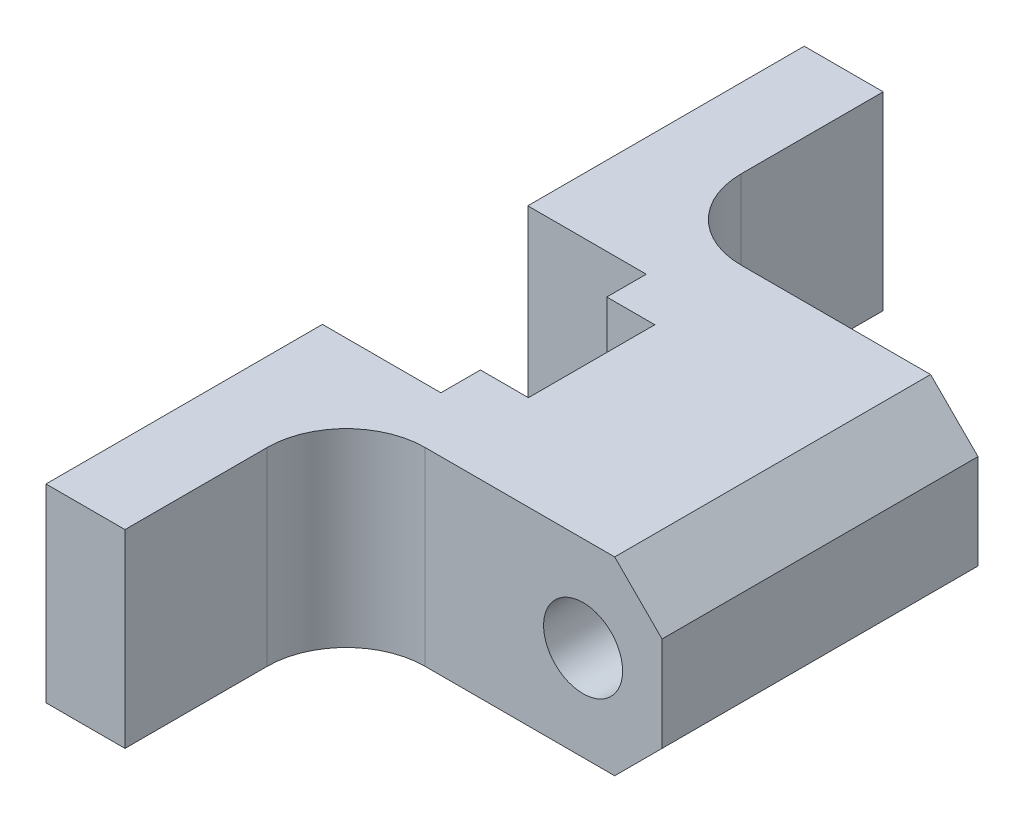
ISO-10303-21;
HEADER;
FILE_DESCRIPTION(('STEP AP214'),'2;1');
FILE_NAME('part.step','',(''),(''),'','','');
FILE_SCHEMA(('AUTOMOTIVE_DESIGN { 1 0 10303 214 1 1 1 1 }'));
ENDSEC;
DATA;
#1=APPLICATION_CONTEXT('core data for automotive mechanical design processes');
#2=APPLICATION_PROTOCOL_DEFINITION('international standard','automotive_design',2000,#1);
#3=PRODUCT_CONTEXT('',#1,'mechanical');
#4=PRODUCT('Part','Part','',(#3));
#5=PRODUCT_RELATED_PRODUCT_CATEGORY('part','',(#4));
#6=PRODUCT_DEFINITION_FORMATION('','',#4);
#7=PRODUCT_DEFINITION_CONTEXT('part definition',#1,'design');
#8=PRODUCT_DEFINITION('design','',#6,#7);
#9=PRODUCT_DEFINITION_SHAPE('','',#8);
#10=(LENGTH_UNIT() NAMED_UNIT(*) SI_UNIT(.MILLI.,.METRE.));
#11=(NAMED_UNIT(*) PLANE_ANGLE_UNIT() SI_UNIT($,.RADIAN.));
#12=(NAMED_UNIT(*) SI_UNIT($,.STERADIAN.) SOLID_ANGLE_UNIT());
#13=UNCERTAINTY_MEASURE_WITH_UNIT(LENGTH_MEASURE(1.E-05),#10,'distance_accuracy_value','');
#14=(GEOMETRIC_REPRESENTATION_CONTEXT(3) GLOBAL_UNCERTAINTY_ASSIGNED_CONTEXT((#13)) GLOBAL_UNIT_ASSIGNED_CONTEXT((#10,
#11,#12)) REPRESENTATION_CONTEXT('',''));
#15=CARTESIAN_POINT('',(0.,0.,0.));
#16=DIRECTION('',(0.,0.,1.));
#17=DIRECTION('',(1.,0.,0.));
#18=AXIS2_PLACEMENT_3D('',#15,#16,#17);
#19=CARTESIAN_POINT('',(0.,-46.6305555757172,0.));
#20=DIRECTION('',(1.,0.,0.));
#21=DIRECTION('',(0.,0.,-1.));
#22=AXIS2_PLACEMENT_3D('',#19,#20,#21);
#23=PLANE('',#22);
#24=DIRECTION('',(0.,0.,-1.));
#25=VECTOR('',#24,1.);
#26=CARTESIAN_POINT('',(0.,-46.6305555757172,20.));
#27=LINE('',#26,#25);
#28=CARTESIAN_POINT('',(0.,-46.6305555757172,3.50000000000001));
#29=VERTEX_POINT('',#28);
#30=CARTESIAN_POINT('',(0.,-46.6305555757172,-14.));
#31=VERTEX_POINT('',#30);
#32=EDGE_CURVE('E267',#29,#31,#27,.T.);
#33=ORIENTED_EDGE('',*,*,#32,.F.);
#34=DIRECTION('',(0.,1.,0.));
#35=VECTOR('',#34,1.);
#36=CARTESIAN_POINT('',(0.,-46.6305555757172,3.50000000000001));
#37=LINE('',#36,#35);
#38=CARTESIAN_POINT('',(0.,-34.6305555757172,3.50000000000001));
#39=VERTEX_POINT('',#38);
#40=EDGE_CURVE('E355',#29,#39,#37,.T.);
#41=ORIENTED_EDGE('',*,*,#40,.T.);
#42=DIRECTION('',(0.,0.,1.));
#43=VECTOR('',#42,1.);
#44=CARTESIAN_POINT('',(0.,-34.6305555757172,20.));
#45=LINE('',#44,#43);
#46=CARTESIAN_POINT('',(0.,-34.6305555757172,-14.));
#47=VERTEX_POINT('',#46);
#48=EDGE_CURVE('E265',#47,#39,#45,.T.);
#49=ORIENTED_EDGE('',*,*,#48,.F.);
#50=DIRECTION('',(0.,-1.,0.));
#51=VECTOR('',#50,1.);
#52=CARTESIAN_POINT('',(0.,-34.6305555757172,-14.));
#53=LINE('',#52,#51);
#54=EDGE_CURVE('E222',#47,#31,#53,.T.);
#55=ORIENTED_EDGE('',*,*,#54,.T.);
#56=EDGE_LOOP('',(#33,#41,#49,#55));
#57=FACE_BOUND('',#56,.T.);
#58=ADVANCED_FACE('F32',(#57),#23,.F.);
#59=CARTESIAN_POINT('',(25.,-34.6305555757172,0.));
#60=DIRECTION('',(0.,0.,1.));
#61=DIRECTION('',(0.,-1.,0.));
#62=AXIS2_PLACEMENT_3D('',#59,#60,#61);
#63=PLANE('',#62);
#64=CARTESIAN_POINT('',(20.,-40.6305555757172,0.));
#65=DIRECTION('',(0.,0.,1.));
#66=DIRECTION('',(1.,0.,0.));
#67=AXIS2_PLACEMENT_3D('',#64,#65,#66);
#68=CIRCLE('',#67,2.5);
#69=CARTESIAN_POINT('',(22.5,-40.6305555757172,0.));
#70=VERTEX_POINT('',#69);
#71=EDGE_CURVE('E251',#70,#70,#68,.T.);
#72=ORIENTED_EDGE('',*,*,#71,.T.);
#73=EDGE_LOOP('',(#72));
#74=FACE_BOUND('',#73,.T.);
#75=DIRECTION('',(-1.,0.,0.));
#76=VECTOR('',#75,1.);
#77=CARTESIAN_POINT('',(25.,-46.6305555757172,0.));
#78=LINE('',#77,#76);
#79=CARTESIAN_POINT('',(22.,-46.6305555757172,0.));
#80=VERTEX_POINT('',#79);
#81=CARTESIAN_POINT('',(10.,-46.6305555757172,0.));
#82=VERTEX_POINT('',#81);
#83=EDGE_CURVE('E264',#80,#82,#78,.T.);
#84=ORIENTED_EDGE('',*,*,#83,.T.);
#85=DIRECTION('',(0.,1.,0.));
#86=VECTOR('',#85,1.);
#87=CARTESIAN_POINT('',(10.,-34.6305555757172,0.));
#88=LINE('',#87,#86);
#89=CARTESIAN_POINT('',(10.,-34.6305555757172,0.));
#90=VERTEX_POINT('',#89);
#91=EDGE_CURVE('E318',#82,#90,#88,.T.);
#92=ORIENTED_EDGE('',*,*,#91,.T.);
#93=DIRECTION('',(-1.,0.,0.));
#94=VECTOR('',#93,1.);
#95=CARTESIAN_POINT('',(25.,-34.6305555757172,0.));
#96=LINE('',#95,#94);
#97=CARTESIAN_POINT('',(22.,-34.6305555757172,0.));
#98=VERTEX_POINT('',#97);
#99=EDGE_CURVE('E281',#98,#90,#96,.T.);
#100=ORIENTED_EDGE('',*,*,#99,.F.);
#101=DIRECTION('',(0.707106781186549,-0.707106781186546,0.));
#102=VECTOR('',#101,1.);
#103=CARTESIAN_POINT('',(25.,-37.6305555757172,0.));
#104=LINE('',#103,#102);
#105=CARTESIAN_POINT('',(25.,-37.6305555757172,0.));
#106=VERTEX_POINT('',#105);
#107=EDGE_CURVE('E287',#98,#106,#104,.T.);
#108=ORIENTED_EDGE('',*,*,#107,.T.);
#109=DIRECTION('',(0.,1.,0.));
#110=VECTOR('',#109,1.);
#111=CARTESIAN_POINT('',(25.,-34.6305555757172,0.));
#112=LINE('',#111,#110);
#113=CARTESIAN_POINT('',(25.,-43.6305555757171,0.));
#114=VERTEX_POINT('',#113);
#115=EDGE_CURVE('E257',#114,#106,#112,.T.);
#116=ORIENTED_EDGE('',*,*,#115,.F.);
#117=DIRECTION('',(-0.707106781186549,-0.707106781186546,0.));
#118=VECTOR('',#117,1.);
#119=CARTESIAN_POINT('',(25.,-43.6305555757171,0.));
#120=LINE('',#119,#118);
#121=EDGE_CURVE('E320',#114,#80,#120,.T.);
#122=ORIENTED_EDGE('',*,*,#121,.T.);
#123=EDGE_LOOP('',(#84,#92,#100,#108,#116,#122));
#124=FACE_BOUND('',#123,.T.);
#125=ADVANCED_FACE('F316',(#74,#124),#63,.F.);
#126=CARTESIAN_POINT('',(25.,-34.6305555757172,20.));
#127=DIRECTION('',(0.,-1.,0.));
#128=DIRECTION('',(0.,0.,-1.));
#129=AXIS2_PLACEMENT_3D('',#126,#127,#128);
#130=PLANE('',#129);
#131=ORIENTED_EDGE('',*,*,#48,.T.);
#132=DIRECTION('',(-1.,0.,0.));
#133=VECTOR('',#132,1.);
#134=CARTESIAN_POINT('',(-15.5,-34.6305555757172,3.50000000000001));
#135=LINE('',#134,#133);
#136=CARTESIAN_POINT('',(7.5,-34.6305555757172,3.50000000000001));
#137=VERTEX_POINT('',#136);
#138=EDGE_CURVE('E180',#137,#39,#135,.T.);
#139=ORIENTED_EDGE('',*,*,#138,.F.);
#140=DIRECTION('',(0.,0.,-1.));
#141=VECTOR('',#140,1.);
#142=CARTESIAN_POINT('',(7.5,-34.6305555757172,3.50000000000001));
#143=LINE('',#142,#141);
#144=CARTESIAN_POINT('',(7.5,-34.6305555757172,6.00000000000001));
#145=VERTEX_POINT('',#144);
#146=EDGE_CURVE('E204',#145,#137,#143,.T.);
#147=ORIENTED_EDGE('',*,*,#146,.F.);
#148=DIRECTION('',(-1.,0.,0.));
#149=VECTOR('',#148,1.);
#150=CARTESIAN_POINT('',(7.5,-34.6305555757172,6.00000000000001));
#151=LINE('',#150,#149);
#152=CARTESIAN_POINT('',(10.5412465760111,-34.6305555757172,6.00000000000001));
#153=VERTEX_POINT('',#152);
#154=EDGE_CURVE('E201',#153,#145,#151,.T.);
#155=ORIENTED_EDGE('',*,*,#154,.F.);
#156=DIRECTION('',(0.,0.,-1.));
#157=VECTOR('',#156,1.);
#158=CARTESIAN_POINT('',(10.5412465760111,-34.6305555757172,6.00000000000001));
#159=LINE('',#158,#157);
#160=CARTESIAN_POINT('',(10.5412465760111,-34.6305555757172,14.));
#161=VERTEX_POINT('',#160);
#162=EDGE_CURVE('E196',#161,#153,#159,.T.);
#163=ORIENTED_EDGE('',*,*,#162,.F.);
#164=DIRECTION('',(1.,0.,0.));
#165=VECTOR('',#164,1.);
#166=CARTESIAN_POINT('',(7.5,-34.6305555757172,14.));
#167=LINE('',#166,#165);
#168=CARTESIAN_POINT('',(7.5,-34.6305555757172,14.));
#169=VERTEX_POINT('',#168);
#170=EDGE_CURVE('E194',#169,#161,#167,.T.);
#171=ORIENTED_EDGE('',*,*,#170,.F.);
#172=DIRECTION('',(0.,0.,-1.));
#173=VECTOR('',#172,1.);
#174=CARTESIAN_POINT('',(7.5,-34.6305555757172,14.));
#175=LINE('',#174,#173);
#176=CARTESIAN_POINT('',(7.5,-34.6305555757172,16.5));
#177=VERTEX_POINT('',#176);
#178=EDGE_CURVE('E173',#177,#169,#175,.T.);
#179=ORIENTED_EDGE('',*,*,#178,.F.);
#180=DIRECTION('',(1.,0.,0.));
#181=VECTOR('',#180,1.);
#182=CARTESIAN_POINT('',(-15.5,-34.6305555757172,16.5));
#183=LINE('',#182,#181);
#184=CARTESIAN_POINT('',(0.,-34.6305555757172,16.5));
#185=VERTEX_POINT('',#184);
#186=EDGE_CURVE('E183',#185,#177,#183,.T.);
#187=ORIENTED_EDGE('',*,*,#186,.F.);
#188=CARTESIAN_POINT('',(0.,-34.6305555757172,34.));
#189=VERTEX_POINT('',#188);
#190=EDGE_CURVE('E254',#185,#189,#45,.T.);
#191=ORIENTED_EDGE('',*,*,#190,.T.);
#192=DIRECTION('',(-1.,0.,0.));
#193=VECTOR('',#192,1.);
#194=CARTESIAN_POINT('',(5.,-34.6305555757172,34.));
#195=LINE('',#194,#193);
#196=CARTESIAN_POINT('',(5.,-34.6305555757172,34.));
#197=VERTEX_POINT('',#196);
#198=EDGE_CURVE('E244',#197,#189,#195,.T.);
#199=ORIENTED_EDGE('',*,*,#198,.F.);
#200=DIRECTION('',(0.,0.,-1.));
#201=VECTOR('',#200,1.);
#202=CARTESIAN_POINT('',(5.,-34.6305555757172,20.));
#203=LINE('',#202,#201);
#204=CARTESIAN_POINT('',(5.,-34.6305555757172,25.));
#205=VERTEX_POINT('',#204);
#206=EDGE_CURVE('E240',#197,#205,#203,.T.);
#207=ORIENTED_EDGE('',*,*,#206,.T.);
#208=CARTESIAN_POINT('',(10.,-34.6305555757172,25.));
#209=DIRECTION('',(0.,-1.,0.));
#210=DIRECTION('',(0.,0.,-1.));
#211=AXIS2_PLACEMENT_3D('',#208,#209,#210);
#212=CIRCLE('',#211,5.);
#213=CARTESIAN_POINT('',(10.,-34.6305555757172,20.));
#214=VERTEX_POINT('',#213);
#215=EDGE_CURVE('E11',#205,#214,#212,.T.);
#216=ORIENTED_EDGE('',*,*,#215,.T.);
#217=DIRECTION('',(-1.,0.,0.));
#218=VECTOR('',#217,1.);
#219=CARTESIAN_POINT('',(25.,-34.6305555757172,20.));
#220=LINE('',#219,#218);
#221=CARTESIAN_POINT('',(22.,-34.6305555757172,20.));
#222=VERTEX_POINT('',#221);
#223=EDGE_CURVE('E286',#222,#214,#220,.T.);
#224=ORIENTED_EDGE('',*,*,#223,.F.);
#225=DIRECTION('',(0.,0.,-1.));
#226=VECTOR('',#225,1.);
#227=CARTESIAN_POINT('',(22.,-34.6305555757172,0.));
#228=LINE('',#227,#226);
#229=EDGE_CURVE('E352',#222,#98,#228,.T.);
#230=ORIENTED_EDGE('',*,*,#229,.T.);
#231=ORIENTED_EDGE('',*,*,#99,.T.);
#232=CARTESIAN_POINT('',(10.,-34.6305555757172,-4.99999999999999));
#233=DIRECTION('',(0.,-1.,0.));
#234=DIRECTION('',(0.,0.,-1.));
#235=AXIS2_PLACEMENT_3D('',#232,#233,#234);
#236=CIRCLE('',#235,5.);
#237=CARTESIAN_POINT('',(5.,-34.6305555757172,-4.99999999999999));
#238=VERTEX_POINT('',#237);
#239=EDGE_CURVE('E301',#90,#238,#236,.T.);
#240=ORIENTED_EDGE('',*,*,#239,.T.);
#241=DIRECTION('',(0.,0.,-1.));
#242=VECTOR('',#241,1.);
#243=CARTESIAN_POINT('',(5.,-34.6305555757172,0.));
#244=LINE('',#243,#242);
#245=CARTESIAN_POINT('',(5.,-34.6305555757172,-14.));
#246=VERTEX_POINT('',#245);
#247=EDGE_CURVE('E227',#238,#246,#244,.T.);
#248=ORIENTED_EDGE('',*,*,#247,.T.);
#249=DIRECTION('',(-1.,0.,0.));
#250=VECTOR('',#249,1.);
#251=CARTESIAN_POINT('',(5.,-34.6305555757172,-14.));
#252=LINE('',#251,#250);
#253=EDGE_CURVE('E234',#246,#47,#252,.T.);
#254=ORIENTED_EDGE('',*,*,#253,.T.);
#255=EDGE_LOOP('',(#131,#139,#147,#155,#163,#171,#179,#187,#191,#199,#207,#216,#224,#230,#231,
#240,#248,#254));
#256=FACE_BOUND('',#255,.T.);
#257=ADVANCED_FACE('F191',(#256),#130,.F.);
#258=CARTESIAN_POINT('',(25.,-34.6305555757172,20.));
#259=DIRECTION('',(0.,0.,-1.));
#260=DIRECTION('',(0.,1.,0.));
#261=AXIS2_PLACEMENT_3D('',#258,#259,#260);
#262=PLANE('',#261);
#263=CARTESIAN_POINT('',(20.,-40.6305555757172,20.));
#264=DIRECTION('',(0.,0.,1.));
#265=DIRECTION('',(1.,0.,0.));
#266=AXIS2_PLACEMENT_3D('',#263,#264,#265);
#267=CIRCLE('',#266,2.5);
#268=CARTESIAN_POINT('',(22.5,-40.6305555757172,20.));
#269=VERTEX_POINT('',#268);
#270=EDGE_CURVE('E247',#269,#269,#267,.T.);
#271=ORIENTED_EDGE('',*,*,#270,.F.);
#272=EDGE_LOOP('',(#271));
#273=FACE_BOUND('',#272,.T.);
#274=ORIENTED_EDGE('',*,*,#223,.T.);
#275=DIRECTION('',(0.,-1.,0.));
#276=VECTOR('',#275,1.);
#277=CARTESIAN_POINT('',(10.,-46.6305555757172,20.));
#278=LINE('',#277,#276);
#279=CARTESIAN_POINT('',(10.,-46.6305555757172,20.));
#280=VERTEX_POINT('',#279);
#281=EDGE_CURVE('E298',#214,#280,#278,.T.);
#282=ORIENTED_EDGE('',*,*,#281,.T.);
#283=DIRECTION('',(-1.,0.,0.));
#284=VECTOR('',#283,1.);
#285=CARTESIAN_POINT('',(25.,-46.6305555757172,20.));
#286=LINE('',#285,#284);
#287=CARTESIAN_POINT('',(22.,-46.6305555757172,20.));
#288=VERTEX_POINT('',#287);
#289=EDGE_CURVE('E278',#288,#280,#286,.T.);
#290=ORIENTED_EDGE('',*,*,#289,.F.);
#291=DIRECTION('',(0.707106781186549,0.707106781186546,0.));
#292=VECTOR('',#291,1.);
#293=CARTESIAN_POINT('',(25.,-43.6305555757171,20.));
#294=LINE('',#293,#292);
#295=CARTESIAN_POINT('',(25.,-43.6305555757171,20.));
#296=VERTEX_POINT('',#295);
#297=EDGE_CURVE('E350',#288,#296,#294,.T.);
#298=ORIENTED_EDGE('',*,*,#297,.T.);
#299=DIRECTION('',(0.,-1.,0.));
#300=VECTOR('',#299,1.);
#301=CARTESIAN_POINT('',(25.,-34.6305555757172,20.));
#302=LINE('',#301,#300);
#303=CARTESIAN_POINT('',(25.,-37.6305555757172,20.));
#304=VERTEX_POINT('',#303);
#305=EDGE_CURVE('E260',#304,#296,#302,.T.);
#306=ORIENTED_EDGE('',*,*,#305,.F.);
#307=DIRECTION('',(-0.707106781186549,0.707106781186546,0.));
#308=VECTOR('',#307,1.);
#309=CARTESIAN_POINT('',(25.,-37.6305555757172,20.));
#310=LINE('',#309,#308);
#311=EDGE_CURVE('E343',#304,#222,#310,.T.);
#312=ORIENTED_EDGE('',*,*,#311,.T.);
#313=EDGE_LOOP('',(#274,#282,#290,#298,#306,#312));
#314=FACE_BOUND('',#313,.T.);
#315=ADVANCED_FACE('F395',(#273,#314),#262,.F.);
#316=CARTESIAN_POINT('',(25.,-46.6305555757172,20.));
#317=DIRECTION('',(0.,1.,0.));
#318=DIRECTION('',(0.,0.,1.));
#319=AXIS2_PLACEMENT_3D('',#316,#317,#318);
#320=PLANE('',#319);
#321=DIRECTION('',(0.,0.,-1.));
#322=VECTOR('',#321,1.);
#323=CARTESIAN_POINT('',(7.50000000000001,-46.6305555757172,20.));
#324=LINE('',#323,#322);
#325=CARTESIAN_POINT('',(7.5,-46.6305555757172,6.00000000000001));
#326=VERTEX_POINT('',#325);
#327=CARTESIAN_POINT('',(7.5,-46.6305555757172,3.50000000000001));
#328=VERTEX_POINT('',#327);
#329=EDGE_CURVE('E323',#326,#328,#324,.T.);
#330=ORIENTED_EDGE('',*,*,#329,.T.);
#331=DIRECTION('',(-1.,0.,0.));
#332=VECTOR('',#331,1.);
#333=CARTESIAN_POINT('',(25.,-46.6305555757172,3.50000000000001));
#334=LINE('',#333,#332);
#335=EDGE_CURVE('E219',#328,#29,#334,.T.);
#336=ORIENTED_EDGE('',*,*,#335,.T.);
#337=ORIENTED_EDGE('',*,*,#32,.T.);
#338=DIRECTION('',(-1.,0.,0.));
#339=VECTOR('',#338,1.);
#340=CARTESIAN_POINT('',(5.,-46.6305555757172,-14.));
#341=LINE('',#340,#339);
#342=CARTESIAN_POINT('',(5.,-46.6305555757172,-14.));
#343=VERTEX_POINT('',#342);
#344=EDGE_CURVE('E230',#343,#31,#341,.T.);
#345=ORIENTED_EDGE('',*,*,#344,.F.);
#346=DIRECTION('',(0.,0.,1.));
#347=VECTOR('',#346,1.);
#348=CARTESIAN_POINT('',(5.,-46.6305555757172,0.));
#349=LINE('',#348,#347);
#350=CARTESIAN_POINT('',(5.,-46.6305555757172,-4.99999999999999));
#351=VERTEX_POINT('',#350);
#352=EDGE_CURVE('E226',#343,#351,#349,.T.);
#353=ORIENTED_EDGE('',*,*,#352,.T.);
#354=CARTESIAN_POINT('',(10.,-46.6305555757172,-4.99999999999999));
#355=DIRECTION('',(0.,1.,0.));
#356=DIRECTION('',(0.,0.,1.));
#357=AXIS2_PLACEMENT_3D('',#354,#355,#356);
#358=CIRCLE('',#357,5.);
#359=EDGE_CURVE('E303',#351,#82,#358,.T.);
#360=ORIENTED_EDGE('',*,*,#359,.T.);
#361=ORIENTED_EDGE('',*,*,#83,.F.);
#362=DIRECTION('',(0.,0.,1.));
#363=VECTOR('',#362,1.);
#364=CARTESIAN_POINT('',(22.,-46.6305555757172,20.));
#365=LINE('',#364,#363);
#366=EDGE_CURVE('E342',#80,#288,#365,.T.);
#367=ORIENTED_EDGE('',*,*,#366,.T.);
#368=ORIENTED_EDGE('',*,*,#289,.T.);
#369=CARTESIAN_POINT('',(10.,-46.6305555757172,25.));
#370=DIRECTION('',(0.,1.,0.));
#371=DIRECTION('',(0.,0.,1.));
#372=AXIS2_PLACEMENT_3D('',#369,#370,#371);
#373=CIRCLE('',#372,5.);
#374=CARTESIAN_POINT('',(5.,-46.6305555757172,25.));
#375=VERTEX_POINT('',#374);
#376=EDGE_CURVE('E40',#280,#375,#373,.T.);
#377=ORIENTED_EDGE('',*,*,#376,.T.);
#378=DIRECTION('',(0.,0.,1.));
#379=VECTOR('',#378,1.);
#380=CARTESIAN_POINT('',(5.,-46.6305555757172,20.));
#381=LINE('',#380,#379);
#382=CARTESIAN_POINT('',(5.,-46.6305555757172,34.));
#383=VERTEX_POINT('',#382);
#384=EDGE_CURVE('E241',#375,#383,#381,.T.);
#385=ORIENTED_EDGE('',*,*,#384,.T.);
#386=DIRECTION('',(-1.,0.,0.));
#387=VECTOR('',#386,1.);
#388=CARTESIAN_POINT('',(5.,-46.6305555757172,34.));
#389=LINE('',#388,#387);
#390=CARTESIAN_POINT('',(0.,-46.6305555757172,34.));
#391=VERTEX_POINT('',#390);
#392=EDGE_CURVE('E248',#383,#391,#389,.T.);
#393=ORIENTED_EDGE('',*,*,#392,.T.);
#394=CARTESIAN_POINT('',(0.,-46.6305555757172,16.5));
#395=VERTEX_POINT('',#394);
#396=EDGE_CURVE('E261',#391,#395,#27,.T.);
#397=ORIENTED_EDGE('',*,*,#396,.T.);
#398=DIRECTION('',(1.,0.,0.));
#399=VECTOR('',#398,1.);
#400=CARTESIAN_POINT('',(25.,-46.6305555757172,16.5));
#401=LINE('',#400,#399);
#402=CARTESIAN_POINT('',(7.5,-46.6305555757172,16.5));
#403=VERTEX_POINT('',#402);
#404=EDGE_CURVE('E210',#395,#403,#401,.T.);
#405=ORIENTED_EDGE('',*,*,#404,.T.);
#406=DIRECTION('',(0.,0.,-1.));
#407=VECTOR('',#406,1.);
#408=CARTESIAN_POINT('',(7.5,-46.6305555757172,20.));
#409=LINE('',#408,#407);
#410=CARTESIAN_POINT('',(7.5,-46.6305555757172,14.));
#411=VERTEX_POINT('',#410);
#412=EDGE_CURVE('E176',#403,#411,#409,.T.);
#413=ORIENTED_EDGE('',*,*,#412,.T.);
#414=DIRECTION('',(1.,0.,0.));
#415=VECTOR('',#414,1.);
#416=CARTESIAN_POINT('',(25.,-46.6305555757172,14.));
#417=LINE('',#416,#415);
#418=CARTESIAN_POINT('',(10.5412465760111,-46.6305555757172,14.));
#419=VERTEX_POINT('',#418);
#420=EDGE_CURVE('E359',#411,#419,#417,.T.);
#421=ORIENTED_EDGE('',*,*,#420,.T.);
#422=DIRECTION('',(0.,0.,-1.));
#423=VECTOR('',#422,1.);
#424=CARTESIAN_POINT('',(10.5412465760111,-46.6305555757172,20.));
#425=LINE('',#424,#423);
#426=CARTESIAN_POINT('',(10.5412465760111,-46.6305555757172,6.00000000000001));
#427=VERTEX_POINT('',#426);
#428=EDGE_CURVE('E362',#419,#427,#425,.T.);
#429=ORIENTED_EDGE('',*,*,#428,.T.);
#430=DIRECTION('',(-1.,0.,0.));
#431=VECTOR('',#430,1.);
#432=CARTESIAN_POINT('',(25.,-46.6305555757172,6.00000000000001));
#433=LINE('',#432,#431);
#434=EDGE_CURVE('E325',#427,#326,#433,.T.);
#435=ORIENTED_EDGE('',*,*,#434,.T.);
#436=EDGE_LOOP('',(#330,#336,#337,#345,#353,#360,#361,#367,#368,#377,#385,#393,#397,#405,#413,
#421,#429,#435));
#437=FACE_BOUND('',#436,.T.);
#438=ADVANCED_FACE('F308',(#437),#320,.F.);
#439=CARTESIAN_POINT('',(25.,-46.6305555757172,0.));
#440=DIRECTION('',(1.,0.,0.));
#441=DIRECTION('',(0.,0.,-1.));
#442=AXIS2_PLACEMENT_3D('',#439,#440,#441);
#443=PLANE('',#442);
#444=ORIENTED_EDGE('',*,*,#305,.T.);
#445=DIRECTION('',(0.,0.,-1.));
#446=VECTOR('',#445,1.);
#447=CARTESIAN_POINT('',(25.,-43.6305555757171,0.));
#448=LINE('',#447,#446);
#449=EDGE_CURVE('E279',#296,#114,#448,.T.);
#450=ORIENTED_EDGE('',*,*,#449,.T.);
#451=ORIENTED_EDGE('',*,*,#115,.T.);
#452=DIRECTION('',(0.,0.,1.));
#453=VECTOR('',#452,1.);
#454=CARTESIAN_POINT('',(25.,-37.6305555757172,20.));
#455=LINE('',#454,#453);
#456=EDGE_CURVE('E285',#106,#304,#455,.T.);
#457=ORIENTED_EDGE('',*,*,#456,.T.);
#458=EDGE_LOOP('',(#444,#450,#451,#457));
#459=FACE_BOUND('',#458,.T.);
#460=ADVANCED_FACE('F404',(#459),#443,.T.);
#461=ORIENTED_EDGE('',*,*,#190,.F.);
#462=DIRECTION('',(0.,-1.,0.));
#463=VECTOR('',#462,1.);
#464=CARTESIAN_POINT('',(0.,-46.6305555757172,16.5));
#465=LINE('',#464,#463);
#466=EDGE_CURVE('E186',#185,#395,#465,.T.);
#467=ORIENTED_EDGE('',*,*,#466,.T.);
#468=ORIENTED_EDGE('',*,*,#396,.F.);
#469=DIRECTION('',(0.,1.,0.));
#470=VECTOR('',#469,1.);
#471=CARTESIAN_POINT('',(0.,-34.6305555757172,34.));
#472=LINE('',#471,#470);
#473=EDGE_CURVE('E233',#391,#189,#472,.T.);
#474=ORIENTED_EDGE('',*,*,#473,.T.);
#475=EDGE_LOOP('',(#461,#467,#468,#474));
#476=FACE_BOUND('',#475,.T.);
#477=ADVANCED_FACE('F406',(#476),#23,.F.);
#478=CARTESIAN_POINT('',(20.,-40.6305555757172,0.));
#479=DIRECTION('',(0.,0.,1.));
#480=DIRECTION('',(1.,0.,0.));
#481=AXIS2_PLACEMENT_3D('',#478,#479,#480);
#482=CYLINDRICAL_SURFACE('',#481,2.5);
#483=ORIENTED_EDGE('',*,*,#71,.F.);
#484=EDGE_LOOP('',(#483));
#485=FACE_BOUND('',#484,.T.);
#486=ORIENTED_EDGE('',*,*,#270,.T.);
#487=EDGE_LOOP('',(#486));
#488=FACE_BOUND('',#487,.T.);
#489=ADVANCED_FACE('F412',(#485,#488),#482,.F.);
#490=CARTESIAN_POINT('',(5.,-34.6305555757172,34.));
#491=DIRECTION('',(0.,0.,1.));
#492=DIRECTION('',(1.,0.,0.));
#493=AXIS2_PLACEMENT_3D('',#490,#491,#492);
#494=PLANE('',#493);
#495=ORIENTED_EDGE('',*,*,#473,.F.);
#496=ORIENTED_EDGE('',*,*,#392,.F.);
#497=DIRECTION('',(0.,1.,0.));
#498=VECTOR('',#497,1.);
#499=CARTESIAN_POINT('',(5.,-34.6305555757172,34.));
#500=LINE('',#499,#498);
#501=EDGE_CURVE('E237',#383,#197,#500,.T.);
#502=ORIENTED_EDGE('',*,*,#501,.T.);
#503=ORIENTED_EDGE('',*,*,#198,.T.);
#504=EDGE_LOOP('',(#495,#496,#502,#503));
#505=FACE_BOUND('',#504,.T.);
#506=ADVANCED_FACE('F452',(#505),#494,.T.);
#507=CARTESIAN_POINT('',(5.,-46.6305555757172,20.));
#508=DIRECTION('',(-1.,0.,0.));
#509=DIRECTION('',(0.,0.,1.));
#510=AXIS2_PLACEMENT_3D('',#507,#508,#509);
#511=PLANE('',#510);
#512=ORIENTED_EDGE('',*,*,#384,.F.);
#513=DIRECTION('',(0.,-1.,0.));
#514=VECTOR('',#513,1.);
#515=CARTESIAN_POINT('',(5.,-34.6305555757172,25.));
#516=LINE('',#515,#514);
#517=EDGE_CURVE('E53',#375,#205,#516,.F.);
#518=ORIENTED_EDGE('',*,*,#517,.T.);
#519=ORIENTED_EDGE('',*,*,#206,.F.);
#520=ORIENTED_EDGE('',*,*,#501,.F.);
#521=EDGE_LOOP('',(#512,#518,#519,#520));
#522=FACE_BOUND('',#521,.T.);
#523=ADVANCED_FACE('F449',(#522),#511,.F.);
#524=CARTESIAN_POINT('',(5.,-34.6305555757172,-14.));
#525=DIRECTION('',(0.,0.,-1.));
#526=DIRECTION('',(-1.,0.,0.));
#527=AXIS2_PLACEMENT_3D('',#524,#525,#526);
#528=PLANE('',#527);
#529=ORIENTED_EDGE('',*,*,#54,.F.);
#530=ORIENTED_EDGE('',*,*,#253,.F.);
#531=DIRECTION('',(0.,-1.,0.));
#532=VECTOR('',#531,1.);
#533=CARTESIAN_POINT('',(5.,-34.6305555757172,-14.));
#534=LINE('',#533,#532);
#535=EDGE_CURVE('E223',#246,#343,#534,.T.);
#536=ORIENTED_EDGE('',*,*,#535,.T.);
#537=ORIENTED_EDGE('',*,*,#344,.T.);
#538=EDGE_LOOP('',(#529,#530,#536,#537));
#539=FACE_BOUND('',#538,.T.);
#540=ADVANCED_FACE('F385',(#539),#528,.T.);
#541=CARTESIAN_POINT('',(5.,-46.6305555757172,0.));
#542=DIRECTION('',(1.,0.,0.));
#543=DIRECTION('',(0.,0.,-1.));
#544=AXIS2_PLACEMENT_3D('',#541,#542,#543);
#545=PLANE('',#544);
#546=ORIENTED_EDGE('',*,*,#247,.F.);
#547=DIRECTION('',(0.,1.,0.));
#548=VECTOR('',#547,1.);
#549=CARTESIAN_POINT('',(5.,-46.6305555757172,-4.99999999999999));
#550=LINE('',#549,#548);
#551=EDGE_CURVE('E322',#238,#351,#550,.F.);
#552=ORIENTED_EDGE('',*,*,#551,.T.);
#553=ORIENTED_EDGE('',*,*,#352,.F.);
#554=ORIENTED_EDGE('',*,*,#535,.F.);
#555=EDGE_LOOP('',(#546,#552,#553,#554));
#556=FACE_BOUND('',#555,.T.);
#557=ADVANCED_FACE('F389',(#556),#545,.T.);
#558=CARTESIAN_POINT('',(25.,-43.6305555757171,0.));
#559=DIRECTION('',(0.707106781186546,-0.707106781186549,0.));
#560=DIRECTION('',(0.707106781186549,0.707106781186546,0.));
#561=AXIS2_PLACEMENT_3D('',#558,#559,#560);
#562=PLANE('',#561);
#563=ORIENTED_EDGE('',*,*,#297,.F.);
#564=ORIENTED_EDGE('',*,*,#366,.F.);
#565=ORIENTED_EDGE('',*,*,#121,.F.);
#566=ORIENTED_EDGE('',*,*,#449,.F.);
#567=EDGE_LOOP('',(#563,#564,#565,#566));
#568=FACE_BOUND('',#567,.T.);
#569=ADVANCED_FACE('F403',(#568),#562,.T.);
#570=CARTESIAN_POINT('',(25.,-37.6305555757172,0.));
#571=DIRECTION('',(0.707106781186546,0.707106781186549,0.));
#572=DIRECTION('',(-0.707106781186549,0.707106781186546,0.));
#573=AXIS2_PLACEMENT_3D('',#570,#571,#572);
#574=PLANE('',#573);
#575=ORIENTED_EDGE('',*,*,#107,.F.);
#576=ORIENTED_EDGE('',*,*,#229,.F.);
#577=ORIENTED_EDGE('',*,*,#311,.F.);
#578=ORIENTED_EDGE('',*,*,#456,.F.);
#579=EDGE_LOOP('',(#575,#576,#577,#578));
#580=FACE_BOUND('',#579,.T.);
#581=ADVANCED_FACE('F393',(#580),#574,.T.);
#582=CARTESIAN_POINT('',(7.5,-46.6306055757172,3.50000000000001));
#583=DIRECTION('',(1.,0.,0.));
#584=DIRECTION('',(0.,0.,-1.));
#585=AXIS2_PLACEMENT_3D('',#582,#583,#584);
#586=PLANE('',#585);
#587=DIRECTION('',(0.,1.,0.));
#588=VECTOR('',#587,1.);
#589=CARTESIAN_POINT('',(7.5,-46.6306055757172,6.00000000000001));
#590=LINE('',#589,#588);
#591=EDGE_CURVE('E211',#326,#145,#590,.T.);
#592=ORIENTED_EDGE('',*,*,#591,.T.);
#593=ORIENTED_EDGE('',*,*,#146,.T.);
#594=DIRECTION('',(0.,1.,0.));
#595=VECTOR('',#594,1.);
#596=CARTESIAN_POINT('',(7.5,-46.6306055757172,3.50000000000001));
#597=LINE('',#596,#595);
#598=EDGE_CURVE('E208',#328,#137,#597,.T.);
#599=ORIENTED_EDGE('',*,*,#598,.F.);
#600=ORIENTED_EDGE('',*,*,#329,.F.);
#601=EDGE_LOOP('',(#592,#593,#599,#600));
#602=FACE_BOUND('',#601,.T.);
#603=ADVANCED_FACE('F377',(#602),#586,.F.);
#604=CARTESIAN_POINT('',(7.5,-46.6306055757172,6.00000000000001));
#605=DIRECTION('',(0.,0.,-1.));
#606=DIRECTION('',(-1.,0.,0.));
#607=AXIS2_PLACEMENT_3D('',#604,#605,#606);
#608=PLANE('',#607);
#609=DIRECTION('',(0.,1.,0.));
#610=VECTOR('',#609,1.);
#611=CARTESIAN_POINT('',(10.5412465760111,-46.6306055757172,6.00000000000001));
#612=LINE('',#611,#610);
#613=EDGE_CURVE('E213',#427,#153,#612,.T.);
#614=ORIENTED_EDGE('',*,*,#613,.T.);
#615=ORIENTED_EDGE('',*,*,#154,.T.);
#616=ORIENTED_EDGE('',*,*,#591,.F.);
#617=ORIENTED_EDGE('',*,*,#434,.F.);
#618=EDGE_LOOP('',(#614,#615,#616,#617));
#619=FACE_BOUND('',#618,.T.);
#620=ADVANCED_FACE('F368',(#619),#608,.F.);
#621=CARTESIAN_POINT('',(10.5412465760111,-46.6306055757172,6.00000000000001));
#622=DIRECTION('',(1.,0.,0.));
#623=DIRECTION('',(0.,0.,-1.));
#624=AXIS2_PLACEMENT_3D('',#621,#622,#623);
#625=PLANE('',#624);
#626=DIRECTION('',(0.,1.,0.));
#627=VECTOR('',#626,1.);
#628=CARTESIAN_POINT('',(10.5412465760111,-46.6306055757172,14.));
#629=LINE('',#628,#627);
#630=EDGE_CURVE('E215',#419,#161,#629,.T.);
#631=ORIENTED_EDGE('',*,*,#630,.T.);
#632=ORIENTED_EDGE('',*,*,#162,.T.);
#633=ORIENTED_EDGE('',*,*,#613,.F.);
#634=ORIENTED_EDGE('',*,*,#428,.F.);
#635=EDGE_LOOP('',(#631,#632,#633,#634));
#636=FACE_BOUND('',#635,.T.);
#637=ADVANCED_FACE('F370',(#636),#625,.F.);
#638=CARTESIAN_POINT('',(7.5,-46.6306055757172,14.));
#639=DIRECTION('',(0.,0.,1.));
#640=DIRECTION('',(1.,0.,0.));
#641=AXIS2_PLACEMENT_3D('',#638,#639,#640);
#642=PLANE('',#641);
#643=DIRECTION('',(0.,1.,0.));
#644=VECTOR('',#643,1.);
#645=CARTESIAN_POINT('',(7.5,-46.6306055757172,14.));
#646=LINE('',#645,#644);
#647=EDGE_CURVE('E179',#411,#169,#646,.T.);
#648=ORIENTED_EDGE('',*,*,#647,.T.);
#649=ORIENTED_EDGE('',*,*,#170,.T.);
#650=ORIENTED_EDGE('',*,*,#630,.F.);
#651=ORIENTED_EDGE('',*,*,#420,.F.);
#652=EDGE_LOOP('',(#648,#649,#650,#651));
#653=FACE_BOUND('',#652,.T.);
#654=ADVANCED_FACE('F507',(#653),#642,.F.);
#655=CARTESIAN_POINT('',(7.5,-46.6306055757172,14.));
#656=DIRECTION('',(1.,0.,0.));
#657=DIRECTION('',(0.,0.,-1.));
#658=AXIS2_PLACEMENT_3D('',#655,#656,#657);
#659=PLANE('',#658);
#660=DIRECTION('',(0.,1.,0.));
#661=VECTOR('',#660,1.);
#662=CARTESIAN_POINT('',(7.5,-46.6306055757172,16.5));
#663=LINE('',#662,#661);
#664=EDGE_CURVE('E168',#403,#177,#663,.T.);
#665=ORIENTED_EDGE('',*,*,#664,.T.);
#666=ORIENTED_EDGE('',*,*,#178,.T.);
#667=ORIENTED_EDGE('',*,*,#647,.F.);
#668=ORIENTED_EDGE('',*,*,#412,.F.);
#669=EDGE_LOOP('',(#665,#666,#667,#668));
#670=FACE_BOUND('',#669,.T.);
#671=ADVANCED_FACE('F170',(#670),#659,.F.);
#672=CARTESIAN_POINT('',(-15.5,-46.6306055757172,3.50000000000001));
#673=DIRECTION('',(0.,0.,-1.));
#674=DIRECTION('',(-1.,0.,0.));
#675=AXIS2_PLACEMENT_3D('',#672,#673,#674);
#676=PLANE('',#675);
#677=ORIENTED_EDGE('',*,*,#598,.T.);
#678=ORIENTED_EDGE('',*,*,#138,.T.);
#679=ORIENTED_EDGE('',*,*,#40,.F.);
#680=ORIENTED_EDGE('',*,*,#335,.F.);
#681=EDGE_LOOP('',(#677,#678,#679,#680));
#682=FACE_BOUND('',#681,.T.);
#683=ADVANCED_FACE('F379',(#682),#676,.F.);
#684=CARTESIAN_POINT('',(-15.5,-46.6306055757172,16.5));
#685=DIRECTION('',(0.,0.,1.));
#686=DIRECTION('',(1.,0.,0.));
#687=AXIS2_PLACEMENT_3D('',#684,#685,#686);
#688=PLANE('',#687);
#689=ORIENTED_EDGE('',*,*,#466,.F.);
#690=ORIENTED_EDGE('',*,*,#186,.T.);
#691=ORIENTED_EDGE('',*,*,#664,.F.);
#692=ORIENTED_EDGE('',*,*,#404,.F.);
#693=EDGE_LOOP('',(#689,#690,#691,#692));
#694=FACE_BOUND('',#693,.T.);
#695=ADVANCED_FACE('F184',(#694),#688,.F.);
#696=CARTESIAN_POINT('',(10.,-34.6305555757172,-4.99999999999999));
#697=DIRECTION('',(0.,1.,0.));
#698=DIRECTION('',(0.,0.,1.));
#699=AXIS2_PLACEMENT_3D('',#696,#697,#698);
#700=CYLINDRICAL_SURFACE('',#699,5.);
#701=ORIENTED_EDGE('',*,*,#359,.F.);
#702=ORIENTED_EDGE('',*,*,#551,.F.);
#703=ORIENTED_EDGE('',*,*,#239,.F.);
#704=ORIENTED_EDGE('',*,*,#91,.F.);
#705=EDGE_LOOP('',(#701,#702,#703,#704));
#706=FACE_BOUND('',#705,.T.);
#707=ADVANCED_FACE('F321',(#706),#700,.F.);
#708=CARTESIAN_POINT('',(10.,-34.6305555757172,25.));
#709=DIRECTION('',(0.,1.,0.));
#710=DIRECTION('',(0.,0.,1.));
#711=AXIS2_PLACEMENT_3D('',#708,#709,#710);
#712=CYLINDRICAL_SURFACE('',#711,5.);
#713=ORIENTED_EDGE('',*,*,#215,.F.);
#714=ORIENTED_EDGE('',*,*,#517,.F.);
#715=ORIENTED_EDGE('',*,*,#376,.F.);
#716=ORIENTED_EDGE('',*,*,#281,.F.);
#717=EDGE_LOOP('',(#713,#714,#715,#716));
#718=FACE_BOUND('',#717,.T.);
#719=ADVANCED_FACE('F34',(#718),#712,.F.);
#720=CLOSED_SHELL('',(#58,#125,#257,#315,#438,#460,#477,#489,#506,#523,#540,#557,#569,#581,#603,
#620,#637,#654,#671,#683,#695,#707,#719));
#721=MANIFOLD_SOLID_BREP('B2',#720);
#722=ADVANCED_BREP_SHAPE_REPRESENTATION('',(#18,#721),#14);
#723=SHAPE_DEFINITION_REPRESENTATION(#9,#722);
ENDSEC;
END-ISO-10303-21;
